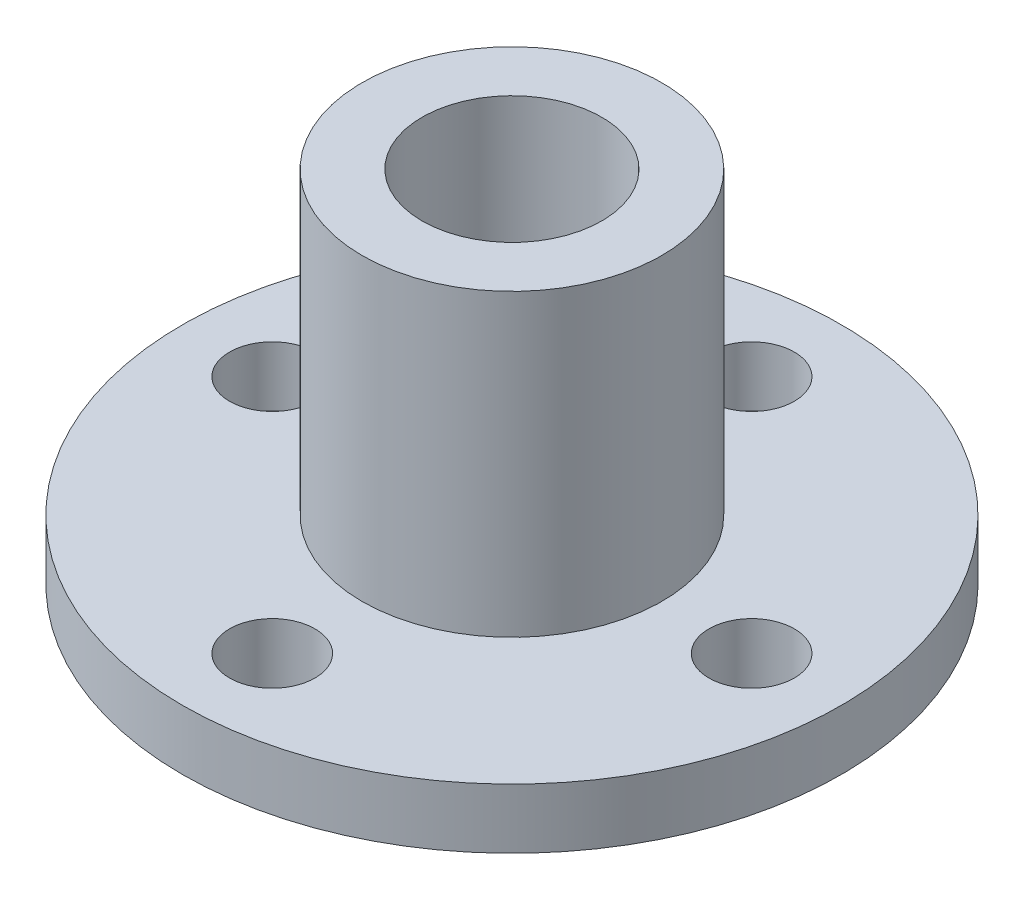
ISO-10303-21;
HEADER;
FILE_DESCRIPTION(('STEP AP214'),'2;1');
FILE_NAME('part.step','',(''),(''),'','','');
FILE_SCHEMA(('AUTOMOTIVE_DESIGN { 1 0 10303 214 1 1 1 1 }'));
ENDSEC;
DATA;
#1=APPLICATION_CONTEXT('core data for automotive mechanical design processes');
#2=APPLICATION_PROTOCOL_DEFINITION('international standard','automotive_design',2000,#1);
#3=PRODUCT_CONTEXT('',#1,'mechanical');
#4=PRODUCT('Part','Part','',(#3));
#5=PRODUCT_RELATED_PRODUCT_CATEGORY('part','',(#4));
#6=PRODUCT_DEFINITION_FORMATION('','',#4);
#7=PRODUCT_DEFINITION_CONTEXT('part definition',#1,'design');
#8=PRODUCT_DEFINITION('design','',#6,#7);
#9=PRODUCT_DEFINITION_SHAPE('','',#8);
#10=(LENGTH_UNIT() NAMED_UNIT(*) SI_UNIT(.MILLI.,.METRE.));
#11=(NAMED_UNIT(*) PLANE_ANGLE_UNIT() SI_UNIT($,.RADIAN.));
#12=(NAMED_UNIT(*) SI_UNIT($,.STERADIAN.) SOLID_ANGLE_UNIT());
#13=UNCERTAINTY_MEASURE_WITH_UNIT(LENGTH_MEASURE(1.E-05),#10,'distance_accuracy_value','');
#14=(GEOMETRIC_REPRESENTATION_CONTEXT(3) GLOBAL_UNCERTAINTY_ASSIGNED_CONTEXT((#13)) GLOBAL_UNIT_ASSIGNED_CONTEXT((#10,
#11,#12)) REPRESENTATION_CONTEXT('',''));
#15=CARTESIAN_POINT('',(0.,0.,0.));
#16=DIRECTION('',(0.,0.,1.));
#17=DIRECTION('',(1.,0.,0.));
#18=AXIS2_PLACEMENT_3D('',#15,#16,#17);
#19=CARTESIAN_POINT('',(0.,2.,0.));
#20=DIRECTION('',(0.,-1.,0.));
#21=DIRECTION('',(0.,0.,-1.));
#22=AXIS2_PLACEMENT_3D('',#19,#20,#21);
#23=CYLINDRICAL_SURFACE('',#22,11.);
#24=CARTESIAN_POINT('',(0.,2.,0.));
#25=DIRECTION('',(0.,1.,0.));
#26=DIRECTION('',(0.,0.,1.));
#27=AXIS2_PLACEMENT_3D('',#24,#25,#26);
#28=CIRCLE('',#27,11.);
#29=CARTESIAN_POINT('',(0.,2.,11.));
#30=VERTEX_POINT('',#29);
#31=EDGE_CURVE('E51',#30,#30,#28,.T.);
#32=ORIENTED_EDGE('',*,*,#31,.F.);
#33=EDGE_LOOP('',(#32));
#34=FACE_BOUND('',#33,.T.);
#35=CARTESIAN_POINT('',(0.,0.,0.));
#36=DIRECTION('',(0.,1.,0.));
#37=DIRECTION('',(0.,0.,1.));
#38=AXIS2_PLACEMENT_3D('',#35,#36,#37);
#39=CIRCLE('',#38,11.);
#40=CARTESIAN_POINT('',(0.,0.,11.));
#41=VERTEX_POINT('',#40);
#42=EDGE_CURVE('E46',#41,#41,#39,.T.);
#43=ORIENTED_EDGE('',*,*,#42,.T.);
#44=EDGE_LOOP('',(#43));
#45=FACE_BOUND('',#44,.T.);
#46=ADVANCED_FACE('F43',(#34,#45),#23,.T.);
#47=CARTESIAN_POINT('',(0.,2.,0.));
#48=DIRECTION('',(0.,1.,0.));
#49=DIRECTION('',(0.,0.,1.));
#50=AXIS2_PLACEMENT_3D('',#47,#48,#49);
#51=PLANE('',#50);
#52=CARTESIAN_POINT('',(0.,2.,-8.));
#53=DIRECTION('',(0.,1.,0.));
#54=DIRECTION('',(0.,0.,1.));
#55=AXIS2_PLACEMENT_3D('',#52,#53,#54);
#56=CIRCLE('',#55,1.425);
#57=CARTESIAN_POINT('',(0.,2.,-6.575));
#58=VERTEX_POINT('',#57);
#59=EDGE_CURVE('E95',#58,#58,#56,.T.);
#60=ORIENTED_EDGE('',*,*,#59,.F.);
#61=EDGE_LOOP('',(#60));
#62=FACE_BOUND('',#61,.T.);
#63=CARTESIAN_POINT('',(8.,2.,0.));
#64=DIRECTION('',(0.,1.,0.));
#65=DIRECTION('',(0.,0.,1.));
#66=AXIS2_PLACEMENT_3D('',#63,#64,#65);
#67=CIRCLE('',#66,1.425);
#68=CARTESIAN_POINT('',(8.,2.,1.42500000000003));
#69=VERTEX_POINT('',#68);
#70=EDGE_CURVE('E91',#69,#69,#67,.T.);
#71=ORIENTED_EDGE('',*,*,#70,.F.);
#72=EDGE_LOOP('',(#71));
#73=FACE_BOUND('',#72,.T.);
#74=CARTESIAN_POINT('',(0.,2.,8.));
#75=DIRECTION('',(0.,1.,0.));
#76=DIRECTION('',(0.,0.,1.));
#77=AXIS2_PLACEMENT_3D('',#74,#75,#76);
#78=CIRCLE('',#77,1.425);
#79=CARTESIAN_POINT('',(0.,2.,9.425));
#80=VERTEX_POINT('',#79);
#81=EDGE_CURVE('E83',#80,#80,#78,.T.);
#82=ORIENTED_EDGE('',*,*,#81,.F.);
#83=EDGE_LOOP('',(#82));
#84=FACE_BOUND('',#83,.T.);
#85=CARTESIAN_POINT('',(-8.,2.,0.));
#86=DIRECTION('',(0.,1.,0.));
#87=DIRECTION('',(0.,0.,1.));
#88=AXIS2_PLACEMENT_3D('',#85,#86,#87);
#89=CIRCLE('',#88,1.425);
#90=CARTESIAN_POINT('',(-8.,2.,1.42499999999992));
#91=VERTEX_POINT('',#90);
#92=EDGE_CURVE('E75',#91,#91,#89,.T.);
#93=ORIENTED_EDGE('',*,*,#92,.F.);
#94=EDGE_LOOP('',(#93));
#95=FACE_BOUND('',#94,.T.);
#96=CARTESIAN_POINT('',(0.,2.,0.));
#97=DIRECTION('',(0.,1.,0.));
#98=DIRECTION('',(0.,0.,1.));
#99=AXIS2_PLACEMENT_3D('',#96,#97,#98);
#100=CIRCLE('',#99,5.);
#101=CARTESIAN_POINT('',(0.,2.,5.));
#102=VERTEX_POINT('',#101);
#103=EDGE_CURVE('E10',#102,#102,#100,.T.);
#104=ORIENTED_EDGE('',*,*,#103,.F.);
#105=EDGE_LOOP('',(#104));
#106=FACE_BOUND('',#105,.T.);
#107=ORIENTED_EDGE('',*,*,#31,.T.);
#108=EDGE_LOOP('',(#107));
#109=FACE_BOUND('',#108,.T.);
#110=ADVANCED_FACE('F113',(#62,#73,#84,#95,#106,#109),#51,.T.);
#111=CARTESIAN_POINT('',(0.,0.,0.));
#112=DIRECTION('',(0.,1.,0.));
#113=DIRECTION('',(0.,0.,1.));
#114=AXIS2_PLACEMENT_3D('',#111,#112,#113);
#115=PLANE('',#114);
#116=CARTESIAN_POINT('',(0.,0.,-8.));
#117=DIRECTION('',(0.,1.,0.));
#118=DIRECTION('',(0.,0.,1.));
#119=AXIS2_PLACEMENT_3D('',#116,#117,#118);
#120=CIRCLE('',#119,1.425);
#121=CARTESIAN_POINT('',(0.,0.,-6.575));
#122=VERTEX_POINT('',#121);
#123=EDGE_CURVE('E67',#122,#122,#120,.T.);
#124=ORIENTED_EDGE('',*,*,#123,.T.);
#125=EDGE_LOOP('',(#124));
#126=FACE_BOUND('',#125,.T.);
#127=CARTESIAN_POINT('',(8.,0.,0.));
#128=DIRECTION('',(0.,1.,0.));
#129=DIRECTION('',(0.,0.,1.));
#130=AXIS2_PLACEMENT_3D('',#127,#128,#129);
#131=CIRCLE('',#130,1.425);
#132=CARTESIAN_POINT('',(8.,0.,1.42500000000003));
#133=VERTEX_POINT('',#132);
#134=EDGE_CURVE('E87',#133,#133,#131,.T.);
#135=ORIENTED_EDGE('',*,*,#134,.T.);
#136=EDGE_LOOP('',(#135));
#137=FACE_BOUND('',#136,.T.);
#138=CARTESIAN_POINT('',(0.,0.,8.));
#139=DIRECTION('',(0.,1.,0.));
#140=DIRECTION('',(0.,0.,1.));
#141=AXIS2_PLACEMENT_3D('',#138,#139,#140);
#142=CIRCLE('',#141,1.425);
#143=CARTESIAN_POINT('',(0.,0.,9.425));
#144=VERTEX_POINT('',#143);
#145=EDGE_CURVE('E79',#144,#144,#142,.T.);
#146=ORIENTED_EDGE('',*,*,#145,.T.);
#147=EDGE_LOOP('',(#146));
#148=FACE_BOUND('',#147,.T.);
#149=CARTESIAN_POINT('',(-8.,0.,0.));
#150=DIRECTION('',(0.,1.,0.));
#151=DIRECTION('',(0.,0.,1.));
#152=AXIS2_PLACEMENT_3D('',#149,#150,#151);
#153=CIRCLE('',#152,1.425);
#154=CARTESIAN_POINT('',(-8.,0.,1.42499999999992));
#155=VERTEX_POINT('',#154);
#156=EDGE_CURVE('E71',#155,#155,#153,.T.);
#157=ORIENTED_EDGE('',*,*,#156,.T.);
#158=EDGE_LOOP('',(#157));
#159=FACE_BOUND('',#158,.T.);
#160=CARTESIAN_POINT('',(0.,0.,0.));
#161=DIRECTION('',(0.,1.,0.));
#162=DIRECTION('',(0.,0.,1.));
#163=AXIS2_PLACEMENT_3D('',#160,#161,#162);
#164=CIRCLE('',#163,3.);
#165=CARTESIAN_POINT('',(0.,0.,3.));
#166=VERTEX_POINT('',#165);
#167=EDGE_CURVE('E62',#166,#166,#164,.T.);
#168=ORIENTED_EDGE('',*,*,#167,.T.);
#169=EDGE_LOOP('',(#168));
#170=FACE_BOUND('',#169,.T.);
#171=ORIENTED_EDGE('',*,*,#42,.F.);
#172=EDGE_LOOP('',(#171));
#173=FACE_BOUND('',#172,.T.);
#174=ADVANCED_FACE('F103',(#126,#137,#148,#159,#170,#173),#115,.F.);
#175=CARTESIAN_POINT('',(0.,12.,0.));
#176=DIRECTION('',(0.,-1.,0.));
#177=DIRECTION('',(0.,0.,-1.));
#178=AXIS2_PLACEMENT_3D('',#175,#176,#177);
#179=CYLINDRICAL_SURFACE('',#178,5.);
#180=CARTESIAN_POINT('',(0.,12.,0.));
#181=DIRECTION('',(0.,1.,0.));
#182=DIRECTION('',(0.,0.,1.));
#183=AXIS2_PLACEMENT_3D('',#180,#181,#182);
#184=CIRCLE('',#183,5.);
#185=CARTESIAN_POINT('',(0.,12.,5.));
#186=VERTEX_POINT('',#185);
#187=EDGE_CURVE('E58',#186,#186,#184,.T.);
#188=ORIENTED_EDGE('',*,*,#187,.F.);
#189=EDGE_LOOP('',(#188));
#190=FACE_BOUND('',#189,.T.);
#191=ORIENTED_EDGE('',*,*,#103,.T.);
#192=EDGE_LOOP('',(#191));
#193=FACE_BOUND('',#192,.T.);
#194=ADVANCED_FACE('F133',(#190,#193),#179,.T.);
#195=CARTESIAN_POINT('',(0.,12.,0.));
#196=DIRECTION('',(0.,1.,0.));
#197=DIRECTION('',(0.,0.,1.));
#198=AXIS2_PLACEMENT_3D('',#195,#196,#197);
#199=PLANE('',#198);
#200=CARTESIAN_POINT('',(0.,12.,0.));
#201=DIRECTION('',(0.,1.,0.));
#202=DIRECTION('',(0.,0.,1.));
#203=AXIS2_PLACEMENT_3D('',#200,#201,#202);
#204=CIRCLE('',#203,3.);
#205=CARTESIAN_POINT('',(0.,12.,3.));
#206=VERTEX_POINT('',#205);
#207=EDGE_CURVE('E63',#206,#206,#204,.T.);
#208=ORIENTED_EDGE('',*,*,#207,.F.);
#209=EDGE_LOOP('',(#208));
#210=FACE_BOUND('',#209,.T.);
#211=ORIENTED_EDGE('',*,*,#187,.T.);
#212=EDGE_LOOP('',(#211));
#213=FACE_BOUND('',#212,.T.);
#214=ADVANCED_FACE('F138',(#210,#213),#199,.T.);
#215=CARTESIAN_POINT('',(0.,0.,0.));
#216=DIRECTION('',(0.,1.,0.));
#217=DIRECTION('',(0.,0.,1.));
#218=AXIS2_PLACEMENT_3D('',#215,#216,#217);
#219=CYLINDRICAL_SURFACE('',#218,3.);
#220=ORIENTED_EDGE('',*,*,#167,.F.);
#221=EDGE_LOOP('',(#220));
#222=FACE_BOUND('',#221,.T.);
#223=ORIENTED_EDGE('',*,*,#207,.T.);
#224=EDGE_LOOP('',(#223));
#225=FACE_BOUND('',#224,.T.);
#226=ADVANCED_FACE('F144',(#222,#225),#219,.F.);
#227=CARTESIAN_POINT('',(-8.,0.,0.));
#228=DIRECTION('',(0.,1.,0.));
#229=DIRECTION('',(0.,0.,1.));
#230=AXIS2_PLACEMENT_3D('',#227,#228,#229);
#231=CYLINDRICAL_SURFACE('',#230,1.425);
#232=ORIENTED_EDGE('',*,*,#156,.F.);
#233=EDGE_LOOP('',(#232));
#234=FACE_BOUND('',#233,.T.);
#235=ORIENTED_EDGE('',*,*,#92,.T.);
#236=EDGE_LOOP('',(#235));
#237=FACE_BOUND('',#236,.T.);
#238=ADVANCED_FACE('F148',(#234,#237),#231,.F.);
#239=CARTESIAN_POINT('',(0.,0.,8.));
#240=DIRECTION('',(0.,1.,0.));
#241=DIRECTION('',(0.,0.,1.));
#242=AXIS2_PLACEMENT_3D('',#239,#240,#241);
#243=CYLINDRICAL_SURFACE('',#242,1.425);
#244=ORIENTED_EDGE('',*,*,#145,.F.);
#245=EDGE_LOOP('',(#244));
#246=FACE_BOUND('',#245,.T.);
#247=ORIENTED_EDGE('',*,*,#81,.T.);
#248=EDGE_LOOP('',(#247));
#249=FACE_BOUND('',#248,.T.);
#250=ADVANCED_FACE('F151',(#246,#249),#243,.F.);
#251=CARTESIAN_POINT('',(8.,0.,0.));
#252=DIRECTION('',(0.,1.,0.));
#253=DIRECTION('',(0.,0.,1.));
#254=AXIS2_PLACEMENT_3D('',#251,#252,#253);
#255=CYLINDRICAL_SURFACE('',#254,1.425);
#256=ORIENTED_EDGE('',*,*,#134,.F.);
#257=EDGE_LOOP('',(#256));
#258=FACE_BOUND('',#257,.T.);
#259=ORIENTED_EDGE('',*,*,#70,.T.);
#260=EDGE_LOOP('',(#259));
#261=FACE_BOUND('',#260,.T.);
#262=ADVANCED_FACE('F109',(#258,#261),#255,.F.);
#263=CARTESIAN_POINT('',(0.,0.,-8.));
#264=DIRECTION('',(0.,1.,0.));
#265=DIRECTION('',(0.,0.,1.));
#266=AXIS2_PLACEMENT_3D('',#263,#264,#265);
#267=CYLINDRICAL_SURFACE('',#266,1.425);
#268=ORIENTED_EDGE('',*,*,#123,.F.);
#269=EDGE_LOOP('',(#268));
#270=FACE_BOUND('',#269,.T.);
#271=ORIENTED_EDGE('',*,*,#59,.T.);
#272=EDGE_LOOP('',(#271));
#273=FACE_BOUND('',#272,.T.);
#274=ADVANCED_FACE('F106',(#270,#273),#267,.F.);
#275=CLOSED_SHELL('',(#46,#110,#174,#194,#214,#226,#238,#250,#262,#274));
#276=MANIFOLD_SOLID_BREP('B2',#275);
#277=ADVANCED_BREP_SHAPE_REPRESENTATION('',(#18,#276),#14);
#278=SHAPE_DEFINITION_REPRESENTATION(#9,#277);
ENDSEC;
END-ISO-10303-21;
